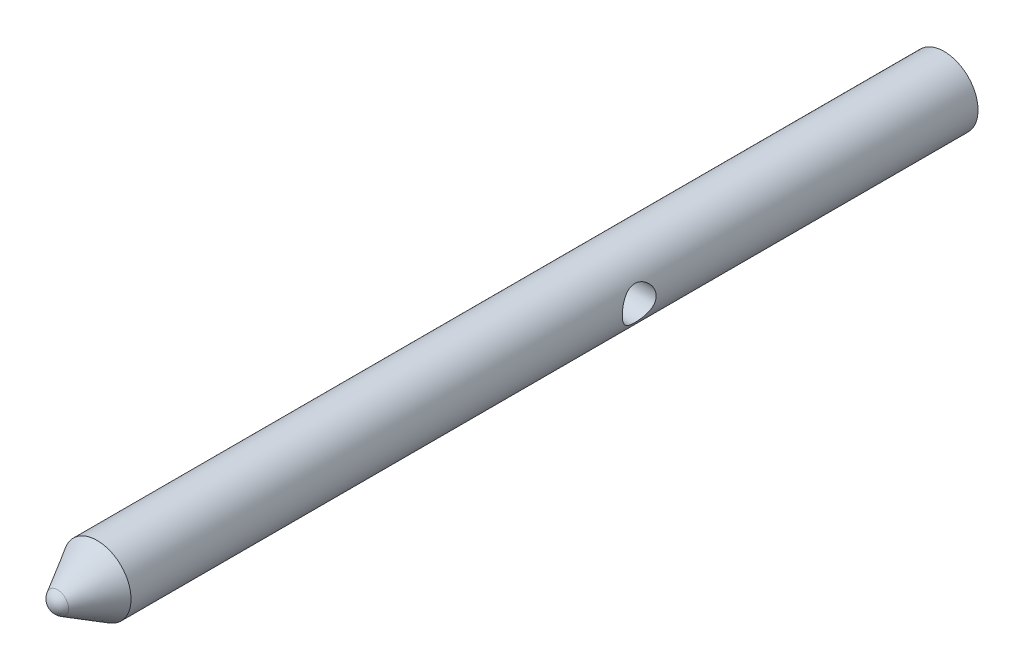
ISO-10303-21;
HEADER;
FILE_DESCRIPTION(('STEP AP214'),'2;1');
FILE_NAME('part.step','',(''),(''),'','','');
FILE_SCHEMA(('AUTOMOTIVE_DESIGN { 1 0 10303 214 1 1 1 1 }'));
ENDSEC;
DATA;
#1=APPLICATION_CONTEXT('core data for automotive mechanical design processes');
#2=APPLICATION_PROTOCOL_DEFINITION('international standard','automotive_design',2000,#1);
#3=PRODUCT_CONTEXT('',#1,'mechanical');
#4=PRODUCT('Part','Part','',(#3));
#5=PRODUCT_RELATED_PRODUCT_CATEGORY('part','',(#4));
#6=PRODUCT_DEFINITION_FORMATION('','',#4);
#7=PRODUCT_DEFINITION_CONTEXT('part definition',#1,'design');
#8=PRODUCT_DEFINITION('design','',#6,#7);
#9=PRODUCT_DEFINITION_SHAPE('','',#8);
#10=(LENGTH_UNIT() NAMED_UNIT(*) SI_UNIT(.MILLI.,.METRE.));
#11=(NAMED_UNIT(*) PLANE_ANGLE_UNIT() SI_UNIT($,.RADIAN.));
#12=(NAMED_UNIT(*) SI_UNIT($,.STERADIAN.) SOLID_ANGLE_UNIT());
#13=UNCERTAINTY_MEASURE_WITH_UNIT(LENGTH_MEASURE(1.E-05),#10,'distance_accuracy_value','');
#14=(GEOMETRIC_REPRESENTATION_CONTEXT(3) GLOBAL_UNCERTAINTY_ASSIGNED_CONTEXT((#13)) GLOBAL_UNIT_ASSIGNED_CONTEXT((#10,
#11,#12)) REPRESENTATION_CONTEXT('',''));
#15=CARTESIAN_POINT('',(0.,0.,0.));
#16=DIRECTION('',(0.,0.,1.));
#17=DIRECTION('',(1.,0.,0.));
#18=AXIS2_PLACEMENT_3D('',#15,#16,#17);
#19=CARTESIAN_POINT('',(0.,0.,103.928203230275));
#20=DIRECTION('',(0.,0.,-1.));
#21=DIRECTION('',(0.,1.,0.));
#22=AXIS2_PLACEMENT_3D('',#19,#20,#21);
#23=SPHERICAL_SURFACE('',#22,1.5);
#24=CARTESIAN_POINT('',(0.,0.,104.678203230275));
#25=DIRECTION('',(0.,0.,-1.));
#26=DIRECTION('',(-1.,0.,0.));
#27=AXIS2_PLACEMENT_3D('',#24,#25,#26);
#28=CIRCLE('',#27,1.29903810567665);
#29=CARTESIAN_POINT('',(-1.29903810567665,0.,104.678203230275));
#30=VERTEX_POINT('',#29);
#31=EDGE_CURVE('E44',#30,#30,#28,.T.);
#32=ORIENTED_EDGE('',*,*,#31,.F.);
#33=EDGE_LOOP('',(#32));
#34=FACE_BOUND('',#33,.T.);
#35=ADVANCED_FACE('F30',(#34),#23,.T.);
#36=CARTESIAN_POINT('',(0.,0.,100.));
#37=DIRECTION('',(0.,0.,-1.));
#38=DIRECTION('',(-1.,0.,0.));
#39=AXIS2_PLACEMENT_3D('',#36,#37,#38);
#40=CONICAL_SURFACE('',#39,3.99999999999999,0.523598775598301);
#41=CARTESIAN_POINT('',(0.,0.,100.));
#42=DIRECTION('',(0.,0.,-1.));
#43=DIRECTION('',(-1.,0.,0.));
#44=AXIS2_PLACEMENT_3D('',#41,#42,#43);
#45=CIRCLE('',#44,3.99999999999999);
#46=CARTESIAN_POINT('',(-3.99999999999998,0.,100.));
#47=VERTEX_POINT('',#46);
#48=EDGE_CURVE('E48',#47,#47,#45,.T.);
#49=CARTESIAN_POINT('',(-1.29903810567665,0.,104.678203230275));
#50=CARTESIAN_POINT('',(-1.32717312540919,0.,104.629471946627));
#51=CARTESIAN_POINT('',(-1.35530814514172,0.,104.580740662978));
#52=CARTESIAN_POINT('',(-1.41157818460679,0.,104.483278095681));
#53=CARTESIAN_POINT('',(-1.43971320433932,0.,104.434546812032));
#54=CARTESIAN_POINT('',(-1.49598324380439,0.,104.337084244735));
#55=CARTESIAN_POINT('',(-1.52411826353693,0.,104.288352961086));
#56=CARTESIAN_POINT('',(-1.580388303002,0.,104.190890393788));
#57=CARTESIAN_POINT('',(-1.60852332273453,0.,104.14215911014));
#58=CARTESIAN_POINT('',(-1.6647933621996,0.,104.044696542842));
#59=CARTESIAN_POINT('',(-1.69292838193213,0.,103.995965259194));
#60=CARTESIAN_POINT('',(-1.7491984213972,0.,103.898502691896));
#61=CARTESIAN_POINT('',(-1.77733344112974,0.,103.849771408248));
#62=CARTESIAN_POINT('',(-1.83360348059481,0.,103.75230884095));
#63=CARTESIAN_POINT('',(-1.86173850032734,0.,103.703577557301));
#64=CARTESIAN_POINT('',(-1.91800853979241,0.,103.606114990004));
#65=CARTESIAN_POINT('',(-1.94614355952495,0.,103.557383706355));
#66=CARTESIAN_POINT('',(-2.00241359899002,0.,103.459921139058));
#67=CARTESIAN_POINT('',(-2.03054861872255,0.,103.411189855409));
#68=CARTESIAN_POINT('',(-2.08681865818762,0.,103.313727288112));
#69=CARTESIAN_POINT('',(-2.11495367792016,0.,103.264996004463));
#70=CARTESIAN_POINT('',(-2.17122371738523,0.,103.167533437166));
#71=CARTESIAN_POINT('',(-2.19935873711776,0.,103.118802153517));
#72=CARTESIAN_POINT('',(-2.25562877658283,0.,103.02133958622));
#73=CARTESIAN_POINT('',(-2.28376379631536,0.,102.972608302571));
#74=CARTESIAN_POINT('',(-2.34003383578043,0.,102.875145735273));
#75=CARTESIAN_POINT('',(-2.36816885551297,0.,102.826414451625));
#76=CARTESIAN_POINT('',(-2.42443889497804,0.,102.728951884327));
#77=CARTESIAN_POINT('',(-2.45257391471057,0.,102.680220600679));
#78=CARTESIAN_POINT('',(-2.50884395417564,0.,102.582758033381));
#79=CARTESIAN_POINT('',(-2.53697897390818,0.,102.534026749733));
#80=CARTESIAN_POINT('',(-2.59324901337325,0.,102.436564182435));
#81=CARTESIAN_POINT('',(-2.62138403310578,0.,102.387832898786));
#82=CARTESIAN_POINT('',(-2.67765407257085,0.,102.290370331489));
#83=CARTESIAN_POINT('',(-2.70578909230339,0.,102.24163904784));
#84=CARTESIAN_POINT('',(-2.76205913176846,0.,102.144176480543));
#85=CARTESIAN_POINT('',(-2.79019415150099,0.,102.095445196894));
#86=CARTESIAN_POINT('',(-2.84646419096606,0.,101.997982629597));
#87=CARTESIAN_POINT('',(-2.87459921069859,0.,101.949251345948));
#88=CARTESIAN_POINT('',(-2.93086925016366,0.,101.851788778651));
#89=CARTESIAN_POINT('',(-2.9590042698962,0.,101.803057495002));
#90=CARTESIAN_POINT('',(-3.01527430936127,0.,101.705594927705));
#91=CARTESIAN_POINT('',(-3.0434093290938,0.,101.656863644056));
#92=CARTESIAN_POINT('',(-3.09967936855887,0.,101.559401076759));
#93=CARTESIAN_POINT('',(-3.12781438829141,0.,101.51066979311));
#94=CARTESIAN_POINT('',(-3.18408442775648,0.,101.413207225812));
#95=CARTESIAN_POINT('',(-3.21221944748901,0.,101.364475942164));
#96=CARTESIAN_POINT('',(-3.26848948695408,0.,101.267013374866));
#97=CARTESIAN_POINT('',(-3.29662450668662,0.,101.218282091218));
#98=CARTESIAN_POINT('',(-3.35289454615168,0.,101.12081952392));
#99=CARTESIAN_POINT('',(-3.38102956588422,0.,101.072088240271));
#100=CARTESIAN_POINT('',(-3.43729960534929,0.,100.974625672974));
#101=CARTESIAN_POINT('',(-3.46543462508182,0.,100.925894389325));
#102=CARTESIAN_POINT('',(-3.52170466454689,0.,100.828431822028));
#103=CARTESIAN_POINT('',(-3.54983968427943,0.,100.779700538379));
#104=CARTESIAN_POINT('',(-3.6061097237445,0.,100.682237971082));
#105=CARTESIAN_POINT('',(-3.63424474347703,0.,100.633506687433));
#106=CARTESIAN_POINT('',(-3.6905147829421,0.,100.536044120136));
#107=CARTESIAN_POINT('',(-3.71864980267464,0.,100.487312836487));
#108=CARTESIAN_POINT('',(-3.77491984213971,0.,100.38985026919));
#109=CARTESIAN_POINT('',(-3.80305486187224,0.,100.341118985541));
#110=CARTESIAN_POINT('',(-3.85932490133731,0.,100.243656418244));
#111=CARTESIAN_POINT('',(-3.88745992106985,0.,100.194925134595));
#112=CARTESIAN_POINT('',(-3.94372996053491,0.,100.097462567297));
#113=CARTESIAN_POINT('',(-3.97186498026745,0.,100.048731283649));
#114=CARTESIAN_POINT('',(-3.99999999999998,0.,100.));
#115=B_SPLINE_CURVE_WITH_KNOTS('',3,(#49,#50,#51,#52,#53,#54,#55,#56,#57,#58,#59,#60,#61,#62,
#63,#64,#65,#66,#67,#68,#69,#70,#71,#72,#73,#74,#75,#76,#77,#78,#79,#80,#81,#82,#83,#84,#85,#86,
#87,#88,#89,#90,#91,#92,#93,#94,#95,#96,#97,#98,#99,#100,#101,#102,#103,#104,#105,#106,#107,
#108,#109,#110,#111,#112,#113,#114),.UNSPECIFIED.,.F.,.F.,(4,2,2,2,2,2,2,2,2,2,2,2,2,2,2,2,2,2,
2,2,2,2,2,2,2,2,2,2,2,2,2,2,4),(0.,0.168810118395207,0.337620236790427,0.506430355185634,
0.675240473580841,0.844050591976049,1.01286071037126,1.18167082876646,1.35048094716167,
1.51929106555688,1.68810118395209,1.85691130234729,2.0257214207425,2.19453153913771,
2.36334165753291,2.53215177592812,2.70096189432333,2.86977201271854,3.03858213111374,
3.20739224950895,3.37620236790416,3.54501248629937,3.71382260469457,3.88263272308978,
4.05144284148499,4.2202529598802,4.3890630782754,4.55787319667061,4.72668331506582,
4.89549343346103,5.06430355185623,5.23311367025145,5.40192378864666),.UNSPECIFIED.);
#116=EDGE_CURVE('BSEAM66',#30,#47,#115,.T.);
#117=ORIENTED_EDGE('',*,*,#31,.T.);
#118=ORIENTED_EDGE('',*,*,#48,.F.);
#119=ORIENTED_EDGE('',*,*,#116,.T.);
#120=ORIENTED_EDGE('',*,*,#116,.F.);
#121=EDGE_LOOP('',(#117,#119,#118,#120));
#122=FACE_BOUND('',#121,.T.);
#123=ADVANCED_FACE('F66',(#122),#40,.T.);
#124=CARTESIAN_POINT('',(0.,0.,-5.));
#125=DIRECTION('',(0.,0.,-1.));
#126=DIRECTION('',(-1.,0.,0.));
#127=AXIS2_PLACEMENT_3D('',#124,#125,#126);
#128=CYLINDRICAL_SURFACE('',#127,3.99999999999999);
#129=CARTESIAN_POINT('',(-3.99999999999999,0.,38.));
#130=CARTESIAN_POINT('',(-3.99999426810082,-0.105143925902467,38.0000066046344));
#131=CARTESIAN_POINT('',(-3.99580982039512,-0.210413199395125,38.0083401462421));
#132=CARTESIAN_POINT('',(-3.97948312074313,-0.417840470537792,38.0413057606831));
#133=CARTESIAN_POINT('',(-3.96732575657839,-0.519992173427259,38.0659687859956));
#134=CARTESIAN_POINT('',(-3.9363255880675,-0.717867089760899,38.1303876172333));
#135=CARTESIAN_POINT('',(-3.91750878355074,-0.813613605878295,38.1700847684959));
#136=CARTESIAN_POINT('',(-3.87491553031522,-0.9969452336132,38.26314124273));
#137=CARTESIAN_POINT('',(-3.8511394726705,-1.08453098798012,38.3164994884977));
#138=CARTESIAN_POINT('',(-3.79912516516123,-1.25501563552382,38.4390344989706));
#139=CARTESIAN_POINT('',(-3.77070398255074,-1.33731042224422,38.5089729584793));
#140=CARTESIAN_POINT('',(-3.71319940493485,-1.48955888973396,38.6610429584941));
#141=CARTESIAN_POINT('',(-3.68411552418069,-1.55950316621354,38.7431837035449));
#142=CARTESIAN_POINT('',(-3.62597902394694,-1.69050400090056,38.9249666990468));
#143=CARTESIAN_POINT('',(-3.59710373940263,-1.75045067110328,39.0254721966918));
#144=CARTESIAN_POINT('',(-3.5457195754464,-1.8523364537814,39.2367346719724));
#145=CARTESIAN_POINT('',(-3.52320615213978,-1.89428842993267,39.3474842574455));
#146=CARTESIAN_POINT('',(-3.48915734075616,-1.95626488437718,39.5693302108439));
#147=CARTESIAN_POINT('',(-3.47704543167426,-1.97745171416088,39.6800089041348));
#148=CARTESIAN_POINT('',(-3.46363779897054,-2.00085398661769,39.9039576755589));
#149=CARTESIAN_POINT('',(-3.46233138686575,-2.00308817674615,40.0172250817423));
#150=CARTESIAN_POINT('',(-3.47021860514496,-1.98937457434459,40.2285720486307));
#151=CARTESIAN_POINT('',(-3.47817527324026,-1.97556911907365,40.3268480624461));
#152=CARTESIAN_POINT('',(-3.501524574677,-1.93387969811387,40.5194438187461));
#153=CARTESIAN_POINT('',(-3.51691957663552,-1.90599124779531,40.6137622906106));
#154=CARTESIAN_POINT('',(-3.55374952825481,-1.83641956077201,40.7984582651313));
#155=CARTESIAN_POINT('',(-3.57531681327996,-1.79443013423199,40.8886927975716));
#156=CARTESIAN_POINT('',(-3.62206808562807,-1.69808337533601,41.06126858518));
#157=CARTESIAN_POINT('',(-3.6472536956038,-1.64372048762494,41.1436062712002));
#158=CARTESIAN_POINT('',(-3.70226315806571,-1.51613210982558,41.3090425054865));
#159=CARTESIAN_POINT('',(-3.73227020473492,-1.44138891673856,41.3909137471523));
#160=CARTESIAN_POINT('',(-3.79095246600814,-1.27911115748275,41.5414708371818));
#161=CARTESIAN_POINT('',(-3.81962703917601,-1.19157051314857,41.6101503840678));
#162=CARTESIAN_POINT('',(-3.87403974565927,-1.0010330116637,41.7353713220595));
#163=CARTESIAN_POINT('',(-3.89957968324014,-0.897507183198823,41.7912009448915));
#164=CARTESIAN_POINT('',(-3.94315762242484,-0.6809324309776,41.884194058086));
#165=CARTESIAN_POINT('',(-3.96120157887106,-0.567891152530558,41.9213723700303));
#166=CARTESIAN_POINT('',(-3.9864866748287,-0.345532983321411,41.9729508074333));
#167=CARTESIAN_POINT('',(-3.99449876602619,-0.236683061096659,41.9889824714936));
#168=CARTESIAN_POINT('',(-4.00146026918206,-0.0175591998987088,42.002929462269));
#169=CARTESIAN_POINT('',(-4.00041397442637,0.0927140397398125,42.0008533712789));
#170=CARTESIAN_POINT('',(-3.98982384506869,0.30246594397197,41.9795866231625));
#171=CARTESIAN_POINT('',(-3.98094491376336,0.402118816099858,41.96173493454));
#172=CARTESIAN_POINT('',(-3.9564434262968,0.59681378460388,41.9115238562098));
#173=CARTESIAN_POINT('',(-3.94082012668823,0.691855371382171,41.879162867093));
#174=CARTESIAN_POINT('',(-3.90368502827175,0.877777216899145,41.8000030671339));
#175=CARTESIAN_POINT('',(-3.88201763539261,0.968460794011608,41.7528178997674));
#176=CARTESIAN_POINT('',(-3.83487948634835,1.14092272339854,41.6457849287069));
#177=CARTESIAN_POINT('',(-3.80940711133876,1.22269725955318,41.5859317308092));
#178=CARTESIAN_POINT('',(-3.75416442672395,1.38353537857843,41.4484791493386));
#179=CARTESIAN_POINT('',(-3.72421769686998,1.46154415563805,41.3697142631097));
#180=CARTESIAN_POINT('',(-3.66524783217639,1.60371264223771,41.2001496974446));
#181=CARTESIAN_POINT('',(-3.63622534800093,1.66786277142375,41.1093417623042));
#182=CARTESIAN_POINT('',(-3.58102384412978,1.78341582895804,40.9127126916541));
#183=CARTESIAN_POINT('',(-3.55505059178121,1.8340509916005,40.806377467811));
#184=CARTESIAN_POINT('',(-3.51148144588269,1.91616565186941,40.5849798648501));
#185=CARTESIAN_POINT('',(-3.49387476443499,1.94766983173403,40.4699289470662));
#186=CARTESIAN_POINT('',(-3.47123002051603,1.98772337493375,40.2461795542306));
#187=CARTESIAN_POINT('',(-3.46514766930129,1.99818599281091,40.1379314931295));
#188=CARTESIAN_POINT('',(-3.46330709283206,2.00137830875241,39.921105865671));
#189=CARTESIAN_POINT('',(-3.46754439252779,1.99411569324649,39.8125284625243));
#190=CARTESIAN_POINT('',(-3.48475724102152,1.96385225118662,39.6090329969331));
#191=CARTESIAN_POINT('',(-3.49686188965316,1.94241662868607,39.5137990597105));
#192=CARTESIAN_POINT('',(-3.52742032375304,1.88635071644883,39.3283837611513));
#193=CARTESIAN_POINT('',(-3.54587615139336,1.85171618231985,39.2382040358159));
#194=CARTESIAN_POINT('',(-3.5885706072907,1.76763149060113,39.0587502980269));
#195=CARTESIAN_POINT('',(-3.6131144479184,1.71734227563141,38.9699441963419));
#196=CARTESIAN_POINT('',(-3.6647066326972,1.60430194327479,38.8014509276375));
#197=CARTESIAN_POINT('',(-3.6917562759122,1.54154434248313,38.7217685389578));
#198=CARTESIAN_POINT('',(-3.74924646316183,1.39640665332275,38.5637160352907));
#199=CARTESIAN_POINT('',(-3.77969966613255,1.31256884599453,38.4866817952994));
#200=CARTESIAN_POINT('',(-3.83755504519861,1.1323096124664,38.3474740331295));
#201=CARTESIAN_POINT('',(-3.86495557252389,1.0358814466104,38.2853085210602));
#202=CARTESIAN_POINT('',(-3.91396019133074,0.831863193565897,38.1775272745759));
#203=CARTESIAN_POINT('',(-3.93552192987865,0.724199007553466,38.1320316615271));
#204=CARTESIAN_POINT('',(-3.97002682597973,0.501484202276177,38.0603836644852));
#205=CARTESIAN_POINT('',(-3.98299446726135,0.386455599178204,38.0341763063886));
#206=CARTESIAN_POINT('',(-3.99390923826955,0.225203892981793,38.0122051778285));
#207=CARTESIAN_POINT('',(-3.99618730680501,0.180323758883132,38.0076347182673));
#208=CARTESIAN_POINT('',(-3.9992339395363,0.0903034636101844,38.0015306689718));
#209=CARTESIAN_POINT('',(-4.00000246206761,0.0451632952932575,37.9999971630596));
#210=CARTESIAN_POINT('',(-3.99999999999999,0.,38.));
#211=B_SPLINE_CURVE_WITH_KNOTS('',3,(#129,#130,#131,#132,#133,#134,#135,#136,#137,#138,#139,
#140,#141,#142,#143,#144,#145,#146,#147,#148,#149,#150,#151,#152,#153,#154,#155,#156,#157,#158,
#159,#160,#161,#162,#163,#164,#165,#166,#167,#168,#169,#170,#171,#172,#173,#174,#175,#176,#177,
#178,#179,#180,#181,#182,#183,#184,#185,#186,#187,#188,#189,#190,#191,#192,#193,#194,#195,#196,
#197,#198,#199,#200,#201,#202,#203,#204,#205,#206,#207,#208,#209,#210),.UNSPECIFIED.,.T.,.F.,(4,
2,2,2,2,2,2,2,2,2,2,2,2,2,2,2,2,2,2,2,2,2,2,2,2,2,2,2,2,2,2,2,2,2,2,2,2,2,2,2,4),(0.,
0.315248514840585,0.631096299418396,0.945724310984597,1.26032752116314,1.59396351743618,
1.92785247530807,2.28763452861506,2.64715895796563,2.98516024280459,3.32282714658041,
3.62011424818641,3.91749607851357,4.22180480336976,4.52625042520444,4.86929882667758,
5.21251069197373,5.57166044428882,5.93052433824559,6.25966580942692,6.58865129022953,
6.89213813012245,7.19565843261864,7.50785712055798,7.82018901496679,8.16319221288838,
8.50643177230864,8.86629364323452,9.22569023890902,9.55058615006094,9.87534119729358,
10.1691586049771,10.463070575767,10.7767291356058,11.0905512228726,11.4425048551434,
11.7946476676249,12.1492802732705,12.502898172423,12.6383056026784,12.7737167702213),.UNSPECIFIED.);
#212=CARTESIAN_POINT('',(-3.99999999999999,0.,38.));
#213=VERTEX_POINT('',#212);
#214=EDGE_CURVE('E10',#213,#213,#211,.T.);
#215=ORIENTED_EDGE('',*,*,#214,.F.);
#216=EDGE_LOOP('',(#215));
#217=FACE_BOUND('',#216,.T.);
#218=CARTESIAN_POINT('',(4.,0.,38.));
#219=CARTESIAN_POINT('',(3.99999426810083,0.105143925902467,38.0000066046344));
#220=CARTESIAN_POINT('',(3.99580982039512,0.210413199395125,38.0083401462421));
#221=CARTESIAN_POINT('',(3.97948312074313,0.417840470537792,38.0413057606831));
#222=CARTESIAN_POINT('',(3.96732575657839,0.519992173427259,38.0659687859956));
#223=CARTESIAN_POINT('',(3.9363255880675,0.717867089760899,38.1303876172333));
#224=CARTESIAN_POINT('',(3.91750878355074,0.813613605878295,38.1700847684959));
#225=CARTESIAN_POINT('',(3.87491553031522,0.9969452336132,38.26314124273));
#226=CARTESIAN_POINT('',(3.8511394726705,1.08453098798012,38.3164994884977));
#227=CARTESIAN_POINT('',(3.79912516516123,1.25501563552382,38.4390344989706));
#228=CARTESIAN_POINT('',(3.77070398255074,1.33731042224422,38.5089729584793));
#229=CARTESIAN_POINT('',(3.71319940493485,1.48955888973396,38.6610429584941));
#230=CARTESIAN_POINT('',(3.68411552418068,1.55950316621354,38.7431837035449));
#231=CARTESIAN_POINT('',(3.62597902394694,1.69050400090056,38.9249666990468));
#232=CARTESIAN_POINT('',(3.59710373940263,1.75045067110327,39.0254721966918));
#233=CARTESIAN_POINT('',(3.5457195754464,1.85233645378139,39.2367346719724));
#234=CARTESIAN_POINT('',(3.52320615213978,1.89428842993267,39.3474842574455));
#235=CARTESIAN_POINT('',(3.48915734075616,1.95626488437718,39.5693302108438));
#236=CARTESIAN_POINT('',(3.47704543167426,1.97745171416089,39.6800089041348));
#237=CARTESIAN_POINT('',(3.46363779897054,2.00085398661769,39.9039576755589));
#238=CARTESIAN_POINT('',(3.46233138686575,2.00308817674615,40.0172250817423));
#239=CARTESIAN_POINT('',(3.47021860514496,1.98937457434459,40.2285720486307));
#240=CARTESIAN_POINT('',(3.47817527324026,1.97556911907365,40.3268480624461));
#241=CARTESIAN_POINT('',(3.501524574677,1.93387969811387,40.5194438187461));
#242=CARTESIAN_POINT('',(3.51691957663552,1.90599124779531,40.6137622906106));
#243=CARTESIAN_POINT('',(3.55374952825481,1.83641956077201,40.7984582651313));
#244=CARTESIAN_POINT('',(3.57531681327996,1.79443013423199,40.8886927975716));
#245=CARTESIAN_POINT('',(3.62206808562806,1.69808337533601,41.06126858518));
#246=CARTESIAN_POINT('',(3.6472536956038,1.64372048762494,41.1436062712002));
#247=CARTESIAN_POINT('',(3.70226315806571,1.51613210982558,41.3090425054865));
#248=CARTESIAN_POINT('',(3.73227020473492,1.44138891673856,41.3909137471523));
#249=CARTESIAN_POINT('',(3.79095246600814,1.27911115748274,41.5414708371818));
#250=CARTESIAN_POINT('',(3.81962703917601,1.19157051314857,41.6101503840678));
#251=CARTESIAN_POINT('',(3.87403974565927,1.0010330116637,41.7353713220595));
#252=CARTESIAN_POINT('',(3.89957968324014,0.897507183198823,41.7912009448915));
#253=CARTESIAN_POINT('',(3.94315762242484,0.6809324309776,41.884194058086));
#254=CARTESIAN_POINT('',(3.96120157887106,0.567891152530559,41.9213723700303));
#255=CARTESIAN_POINT('',(3.9864866748287,0.345532983321411,41.9729508074333));
#256=CARTESIAN_POINT('',(3.99449876602619,0.236683061096659,41.9889824714936));
#257=CARTESIAN_POINT('',(4.00146026918206,0.0175591998987094,42.002929462269));
#258=CARTESIAN_POINT('',(4.00041397442637,-0.0927140397398119,42.0008533712789));
#259=CARTESIAN_POINT('',(3.98982384506869,-0.302465943971969,41.9795866231625));
#260=CARTESIAN_POINT('',(3.98094491376336,-0.402118816099856,41.96173493454));
#261=CARTESIAN_POINT('',(3.9564434262968,-0.596813784603879,41.9115238562098));
#262=CARTESIAN_POINT('',(3.94082012668823,-0.691855371382171,41.879162867093));
#263=CARTESIAN_POINT('',(3.90368502827175,-0.877777216899143,41.8000030671339));
#264=CARTESIAN_POINT('',(3.88201763539261,-0.968460794011603,41.7528178997674));
#265=CARTESIAN_POINT('',(3.83487948634835,-1.14092272339854,41.6457849287069));
#266=CARTESIAN_POINT('',(3.80940711133876,-1.22269725955318,41.5859317308092));
#267=CARTESIAN_POINT('',(3.75416442672395,-1.38353537857843,41.4484791493386));
#268=CARTESIAN_POINT('',(3.72421769686998,-1.46154415563805,41.3697142631097));
#269=CARTESIAN_POINT('',(3.66524783217639,-1.60371264223771,41.2001496974446));
#270=CARTESIAN_POINT('',(3.63622534800093,-1.66786277142375,41.1093417623042));
#271=CARTESIAN_POINT('',(3.58102384412978,-1.78341582895804,40.9127126916541));
#272=CARTESIAN_POINT('',(3.55505059178121,-1.8340509916005,40.806377467811));
#273=CARTESIAN_POINT('',(3.51148144588269,-1.91616565186941,40.5849798648501));
#274=CARTESIAN_POINT('',(3.49387476443499,-1.94766983173403,40.4699289470662));
#275=CARTESIAN_POINT('',(3.47123002051603,-1.98772337493375,40.2461795542306));
#276=CARTESIAN_POINT('',(3.46514766930129,-1.99818599281091,40.1379314931295));
#277=CARTESIAN_POINT('',(3.46330709283206,-2.00137830875241,39.921105865671));
#278=CARTESIAN_POINT('',(3.46754439252779,-1.99411569324649,39.8125284625243));
#279=CARTESIAN_POINT('',(3.48475724102152,-1.96385225118662,39.6090329969331));
#280=CARTESIAN_POINT('',(3.49686188965316,-1.94241662868607,39.5137990597105));
#281=CARTESIAN_POINT('',(3.52742032375304,-1.88635071644883,39.3283837611513));
#282=CARTESIAN_POINT('',(3.54587615139336,-1.85171618231985,39.2382040358159));
#283=CARTESIAN_POINT('',(3.5885706072907,-1.76763149060114,39.0587502980269));
#284=CARTESIAN_POINT('',(3.6131144479184,-1.71734227563141,38.9699441963419));
#285=CARTESIAN_POINT('',(3.6647066326972,-1.60430194327479,38.8014509276375));
#286=CARTESIAN_POINT('',(3.6917562759122,-1.54154434248313,38.7217685389578));
#287=CARTESIAN_POINT('',(3.74924646316183,-1.39640665332275,38.5637160352907));
#288=CARTESIAN_POINT('',(3.77969966613255,-1.31256884599453,38.4866817952994));
#289=CARTESIAN_POINT('',(3.83755504519861,-1.1323096124664,38.3474740331295));
#290=CARTESIAN_POINT('',(3.86495557252389,-1.0358814466104,38.2853085210602));
#291=CARTESIAN_POINT('',(3.91396019133074,-0.831863193565898,38.1775272745759));
#292=CARTESIAN_POINT('',(3.93552192987865,-0.724199007553467,38.1320316615271));
#293=CARTESIAN_POINT('',(3.97002682597973,-0.501484202276178,38.0603836644852));
#294=CARTESIAN_POINT('',(3.98299446726135,-0.386455599178205,38.0341763063886));
#295=CARTESIAN_POINT('',(3.99390923826955,-0.225203892981795,38.0122051778285));
#296=CARTESIAN_POINT('',(3.99618730680501,-0.180323758883134,38.0076347182673));
#297=CARTESIAN_POINT('',(3.99923393953631,-0.0903034636101856,38.0015306689718));
#298=CARTESIAN_POINT('',(4.00000246206762,-0.0451632952932581,37.9999971630596));
#299=CARTESIAN_POINT('',(4.,0.,38.));
#300=B_SPLINE_CURVE_WITH_KNOTS('',3,(#218,#219,#220,#221,#222,#223,#224,#225,#226,#227,#228,
#229,#230,#231,#232,#233,#234,#235,#236,#237,#238,#239,#240,#241,#242,#243,#244,#245,#246,#247,
#248,#249,#250,#251,#252,#253,#254,#255,#256,#257,#258,#259,#260,#261,#262,#263,#264,#265,#266,
#267,#268,#269,#270,#271,#272,#273,#274,#275,#276,#277,#278,#279,#280,#281,#282,#283,#284,#285,
#286,#287,#288,#289,#290,#291,#292,#293,#294,#295,#296,#297,#298,#299),.UNSPECIFIED.,.T.,.F.,(4,
2,2,2,2,2,2,2,2,2,2,2,2,2,2,2,2,2,2,2,2,2,2,2,2,2,2,2,2,2,2,2,2,2,2,2,2,2,2,2,4),(0.,
0.315248514840585,0.631096299418396,0.945724310984598,1.26032752116314,1.59396351743619,
1.92785247530807,2.28763452861505,2.64715895796562,2.9851602428046,3.32282714658041,
3.6201142481864,3.91749607851357,4.22180480336975,4.52625042520444,4.86929882667758,
5.21251069197373,5.57166044428881,5.93052433824559,6.25966580942691,6.58865129022952,
6.89213813012244,7.19565843261863,7.50785712055798,7.82018901496678,8.16319221288838,
8.50643177230864,8.86629364323452,9.22569023890902,9.55058615006094,9.87534119729357,
10.1691586049771,10.463070575767,10.7767291356057,11.0905512228726,11.4425048551434,
11.7946476676249,12.1492802732705,12.502898172423,12.6383056026783,12.7737167702213),.UNSPECIFIED.);
#301=CARTESIAN_POINT('',(4.,0.,38.));
#302=VERTEX_POINT('',#301);
#303=EDGE_CURVE('E40',#302,#302,#300,.T.);
#304=ORIENTED_EDGE('',*,*,#303,.F.);
#305=EDGE_LOOP('',(#304));
#306=FACE_BOUND('',#305,.T.);
#307=ORIENTED_EDGE('',*,*,#48,.T.);
#308=EDGE_LOOP('',(#307));
#309=FACE_BOUND('',#308,.T.);
#310=CARTESIAN_POINT('',(0.,0.,0.));
#311=DIRECTION('',(0.,0.,-1.));
#312=DIRECTION('',(-1.,0.,0.));
#313=AXIS2_PLACEMENT_3D('',#310,#311,#312);
#314=CIRCLE('',#313,4.);
#315=CARTESIAN_POINT('',(-4.,0.,0.));
#316=VERTEX_POINT('',#315);
#317=EDGE_CURVE('E80',#316,#316,#314,.T.);
#318=ORIENTED_EDGE('',*,*,#317,.F.);
#319=EDGE_LOOP('',(#318));
#320=FACE_BOUND('',#319,.T.);
#321=ADVANCED_FACE('F53',(#217,#306,#309,#320),#128,.T.);
#322=CARTESIAN_POINT('',(0.,0.,0.));
#323=DIRECTION('',(0.,0.,-1.));
#324=DIRECTION('',(-1.,0.,0.));
#325=AXIS2_PLACEMENT_3D('',#322,#323,#324);
#326=PLANE('',#325);
#327=ORIENTED_EDGE('',*,*,#317,.T.);
#328=EDGE_LOOP('',(#327));
#329=FACE_BOUND('',#328,.T.);
#330=ADVANCED_FACE('F59',(#329),#326,.T.);
#331=CARTESIAN_POINT('',(-4.,0.,40.));
#332=DIRECTION('',(1.,0.,0.));
#333=DIRECTION('',(0.,0.,-1.));
#334=AXIS2_PLACEMENT_3D('',#331,#332,#333);
#335=CYLINDRICAL_SURFACE('',#334,2.);
#336=ORIENTED_EDGE('',*,*,#214,.T.);
#337=EDGE_LOOP('',(#336));
#338=FACE_BOUND('',#337,.T.);
#339=ORIENTED_EDGE('',*,*,#303,.T.);
#340=EDGE_LOOP('',(#339));
#341=FACE_BOUND('',#340,.T.);
#342=ADVANCED_FACE('F56',(#338,#341),#335,.F.);
#343=CLOSED_SHELL('',(#35,#123,#321,#330,#342));
#344=MANIFOLD_SOLID_BREP('B2',#343);
#345=ADVANCED_BREP_SHAPE_REPRESENTATION('',(#18,#344),#14);
#346=SHAPE_DEFINITION_REPRESENTATION(#9,#345);
ENDSEC;
END-ISO-10303-21;
